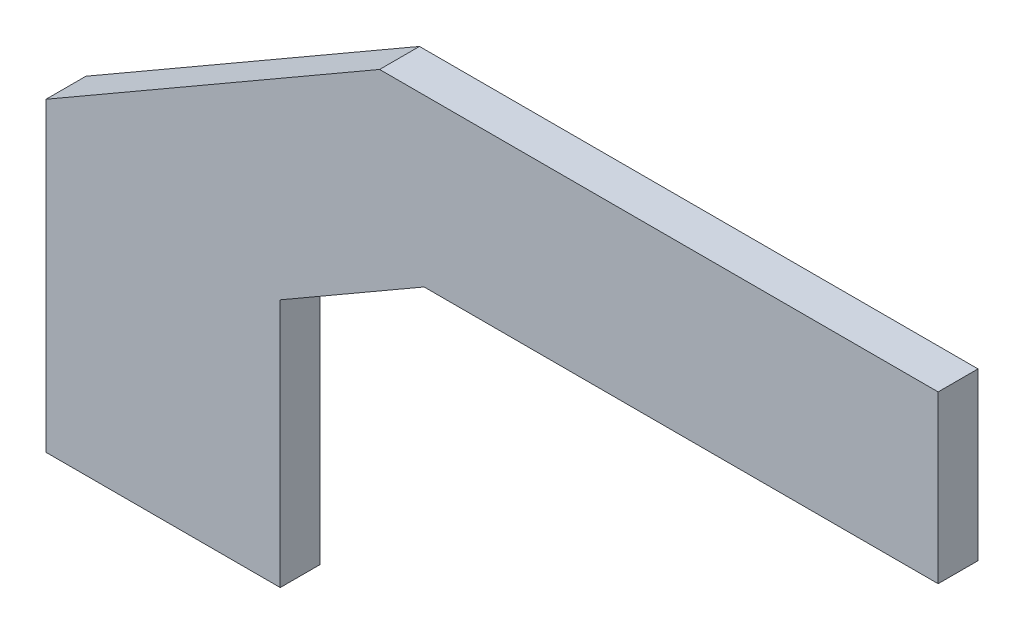
ISO-10303-21;
HEADER;
FILE_DESCRIPTION(('STEP AP214'),'2;1');
FILE_NAME('part.step','',(''),(''),'','','');
FILE_SCHEMA(('AUTOMOTIVE_DESIGN { 1 0 10303 214 1 1 1 1 }'));
ENDSEC;
DATA;
#1=APPLICATION_CONTEXT('core data for automotive mechanical design processes');
#2=APPLICATION_PROTOCOL_DEFINITION('international standard','automotive_design',2000,#1);
#3=PRODUCT_CONTEXT('',#1,'mechanical');
#4=PRODUCT('Part','Part','',(#3));
#5=PRODUCT_RELATED_PRODUCT_CATEGORY('part','',(#4));
#6=PRODUCT_DEFINITION_FORMATION('','',#4);
#7=PRODUCT_DEFINITION_CONTEXT('part definition',#1,'design');
#8=PRODUCT_DEFINITION('design','',#6,#7);
#9=PRODUCT_DEFINITION_SHAPE('','',#8);
#10=(LENGTH_UNIT() NAMED_UNIT(*) SI_UNIT(.MILLI.,.METRE.));
#11=(NAMED_UNIT(*) PLANE_ANGLE_UNIT() SI_UNIT($,.RADIAN.));
#12=(NAMED_UNIT(*) SI_UNIT($,.STERADIAN.) SOLID_ANGLE_UNIT());
#13=UNCERTAINTY_MEASURE_WITH_UNIT(LENGTH_MEASURE(1.E-05),#10,'distance_accuracy_value','');
#14=(GEOMETRIC_REPRESENTATION_CONTEXT(3) GLOBAL_UNCERTAINTY_ASSIGNED_CONTEXT((#13)) GLOBAL_UNIT_ASSIGNED_CONTEXT((#10,
#11,#12)) REPRESENTATION_CONTEXT('',''));
#15=CARTESIAN_POINT('',(0.,0.,0.));
#16=DIRECTION('',(0.,0.,1.));
#17=DIRECTION('',(1.,0.,0.));
#18=AXIS2_PLACEMENT_3D('',#15,#16,#17);
#19=CARTESIAN_POINT('',(1.41,1.5,0.12));
#20=DIRECTION('',(-0.500000000000001,0.866025403784438,0.));
#21=DIRECTION('',(-0.866025403784438,-0.500000000000001,0.));
#22=AXIS2_PLACEMENT_3D('',#19,#20,#21);
#23=PLANE('',#22);
#24=DIRECTION('',(0.866025403784438,0.500000000000001,0.));
#25=VECTOR('',#24,1.);
#26=CARTESIAN_POINT('',(1.41,1.5,-0.12));
#27=LINE('',#26,#25);
#28=CARTESIAN_POINT('',(1.41,1.5,-0.12));
#29=VERTEX_POINT('',#28);
#30=CARTESIAN_POINT('',(2.27602540378444,2.,-0.12));
#31=VERTEX_POINT('',#30);
#32=EDGE_CURVE('E140',#29,#31,#27,.T.);
#33=ORIENTED_EDGE('',*,*,#32,.T.);
#34=DIRECTION('',(0.,0.,-1.));
#35=VECTOR('',#34,1.);
#36=CARTESIAN_POINT('',(2.27602540378444,2.,0.12));
#37=LINE('',#36,#35);
#38=CARTESIAN_POINT('',(2.27602540378444,2.,0.12));
#39=VERTEX_POINT('',#38);
#40=EDGE_CURVE('E11',#39,#31,#37,.T.);
#41=ORIENTED_EDGE('',*,*,#40,.F.);
#42=DIRECTION('',(0.866025403784438,0.500000000000001,0.));
#43=VECTOR('',#42,1.);
#44=CARTESIAN_POINT('',(1.41,1.5,0.12));
#45=LINE('',#44,#43);
#46=CARTESIAN_POINT('',(1.41,1.5,0.12));
#47=VERTEX_POINT('',#46);
#48=EDGE_CURVE('E162',#47,#39,#45,.T.);
#49=ORIENTED_EDGE('',*,*,#48,.F.);
#50=DIRECTION('',(0.,0.,-1.));
#51=VECTOR('',#50,1.);
#52=CARTESIAN_POINT('',(1.41,1.5,0.12));
#53=LINE('',#52,#51);
#54=EDGE_CURVE('E136',#47,#29,#53,.T.);
#55=ORIENTED_EDGE('',*,*,#54,.T.);
#56=EDGE_LOOP('',(#33,#41,#49,#55));
#57=FACE_BOUND('',#56,.T.);
#58=ADVANCED_FACE('F39',(#57),#23,.F.);
#59=CARTESIAN_POINT('',(2.27602540378444,2.,0.12));
#60=DIRECTION('',(0.,1.,0.));
#61=DIRECTION('',(-1.,0.,0.));
#62=AXIS2_PLACEMENT_3D('',#59,#60,#61);
#63=PLANE('',#62);
#64=DIRECTION('',(1.,0.,0.));
#65=VECTOR('',#64,1.);
#66=CARTESIAN_POINT('',(2.27602540378444,2.,-0.12));
#67=LINE('',#66,#65);
#68=CARTESIAN_POINT('',(5.37,2.,-0.12));
#69=VERTEX_POINT('',#68);
#70=EDGE_CURVE('E144',#31,#69,#67,.T.);
#71=ORIENTED_EDGE('',*,*,#70,.T.);
#72=DIRECTION('',(0.,0.,-1.));
#73=VECTOR('',#72,1.);
#74=CARTESIAN_POINT('',(5.37,2.,0.12));
#75=LINE('',#74,#73);
#76=CARTESIAN_POINT('',(5.37,2.,0.12));
#77=VERTEX_POINT('',#76);
#78=EDGE_CURVE('E48',#77,#69,#75,.T.);
#79=ORIENTED_EDGE('',*,*,#78,.F.);
#80=DIRECTION('',(1.,0.,0.));
#81=VECTOR('',#80,1.);
#82=CARTESIAN_POINT('',(2.27602540378444,2.,0.12));
#83=LINE('',#82,#81);
#84=EDGE_CURVE('E99',#39,#77,#83,.T.);
#85=ORIENTED_EDGE('',*,*,#84,.F.);
#86=ORIENTED_EDGE('',*,*,#40,.T.);
#87=EDGE_LOOP('',(#71,#79,#85,#86));
#88=FACE_BOUND('',#87,.T.);
#89=ADVANCED_FACE('F208',(#88),#63,.F.);
#90=CARTESIAN_POINT('',(5.37,2.,0.12));
#91=DIRECTION('',(-1.,0.,0.));
#92=DIRECTION('',(0.,-1.,0.));
#93=AXIS2_PLACEMENT_3D('',#90,#91,#92);
#94=PLANE('',#93);
#95=DIRECTION('',(0.,1.,0.));
#96=VECTOR('',#95,1.);
#97=CARTESIAN_POINT('',(5.37,2.,-0.12));
#98=LINE('',#97,#96);
#99=CARTESIAN_POINT('',(5.37,3.,-0.12));
#100=VERTEX_POINT('',#99);
#101=EDGE_CURVE('E147',#69,#100,#98,.T.);
#102=ORIENTED_EDGE('',*,*,#101,.T.);
#103=DIRECTION('',(0.,0.,-1.));
#104=VECTOR('',#103,1.);
#105=CARTESIAN_POINT('',(5.37,3.,0.12));
#106=LINE('',#105,#104);
#107=CARTESIAN_POINT('',(5.37,3.,0.12));
#108=VERTEX_POINT('',#107);
#109=EDGE_CURVE('E173',#108,#100,#106,.T.);
#110=ORIENTED_EDGE('',*,*,#109,.F.);
#111=DIRECTION('',(0.,1.,0.));
#112=VECTOR('',#111,1.);
#113=CARTESIAN_POINT('',(5.37,2.,0.12));
#114=LINE('',#113,#112);
#115=EDGE_CURVE('E183',#77,#108,#114,.T.);
#116=ORIENTED_EDGE('',*,*,#115,.F.);
#117=ORIENTED_EDGE('',*,*,#78,.T.);
#118=EDGE_LOOP('',(#102,#110,#116,#117));
#119=FACE_BOUND('',#118,.T.);
#120=ADVANCED_FACE('F181',(#119),#94,.F.);
#121=CARTESIAN_POINT('',(5.37,3.,0.12));
#122=DIRECTION('',(0.,-1.,0.));
#123=DIRECTION('',(1.,0.,0.));
#124=AXIS2_PLACEMENT_3D('',#121,#122,#123);
#125=PLANE('',#124);
#126=DIRECTION('',(-1.,0.,0.));
#127=VECTOR('',#126,1.);
#128=CARTESIAN_POINT('',(5.37,3.,-0.12));
#129=LINE('',#128,#127);
#130=CARTESIAN_POINT('',(2.00807621135331,3.,-0.12));
#131=VERTEX_POINT('',#130);
#132=EDGE_CURVE('E150',#100,#131,#129,.T.);
#133=ORIENTED_EDGE('',*,*,#132,.T.);
#134=DIRECTION('',(0.,0.,-1.));
#135=VECTOR('',#134,1.);
#136=CARTESIAN_POINT('',(2.00807621135331,3.,0.12));
#137=LINE('',#136,#135);
#138=CARTESIAN_POINT('',(2.00807621135331,3.,0.12));
#139=VERTEX_POINT('',#138);
#140=EDGE_CURVE('E169',#139,#131,#137,.T.);
#141=ORIENTED_EDGE('',*,*,#140,.F.);
#142=DIRECTION('',(-1.,0.,0.));
#143=VECTOR('',#142,1.);
#144=CARTESIAN_POINT('',(5.37,3.,0.12));
#145=LINE('',#144,#143);
#146=EDGE_CURVE('E196',#108,#139,#145,.T.);
#147=ORIENTED_EDGE('',*,*,#146,.F.);
#148=ORIENTED_EDGE('',*,*,#109,.T.);
#149=EDGE_LOOP('',(#133,#141,#147,#148));
#150=FACE_BOUND('',#149,.T.);
#151=ADVANCED_FACE('F191',(#150),#125,.F.);
#152=CARTESIAN_POINT('',(2.00807621135331,3.,0.12));
#153=DIRECTION('',(0.500000000000001,-0.866025403784438,0.));
#154=DIRECTION('',(0.866025403784438,0.500000000000001,0.));
#155=AXIS2_PLACEMENT_3D('',#152,#153,#154);
#156=PLANE('',#155);
#157=DIRECTION('',(-0.866025403784438,-0.500000000000001,0.));
#158=VECTOR('',#157,1.);
#159=CARTESIAN_POINT('',(2.00807621135331,3.,-0.12));
#160=LINE('',#159,#158);
#161=CARTESIAN_POINT('',(0.,1.84063665882188,-0.12));
#162=VERTEX_POINT('',#161);
#163=EDGE_CURVE('E153',#131,#162,#160,.T.);
#164=ORIENTED_EDGE('',*,*,#163,.T.);
#165=DIRECTION('',(0.,0.,-1.));
#166=VECTOR('',#165,1.);
#167=CARTESIAN_POINT('',(0.,1.84063665882188,0.12));
#168=LINE('',#167,#166);
#169=CARTESIAN_POINT('',(0.,1.84063665882188,0.12));
#170=VERTEX_POINT('',#169);
#171=EDGE_CURVE('E129',#170,#162,#168,.T.);
#172=ORIENTED_EDGE('',*,*,#171,.F.);
#173=DIRECTION('',(-0.866025403784438,-0.500000000000001,0.));
#174=VECTOR('',#173,1.);
#175=CARTESIAN_POINT('',(2.00807621135331,3.,0.12));
#176=LINE('',#175,#174);
#177=EDGE_CURVE('E118',#139,#170,#176,.T.);
#178=ORIENTED_EDGE('',*,*,#177,.F.);
#179=ORIENTED_EDGE('',*,*,#140,.T.);
#180=EDGE_LOOP('',(#164,#172,#178,#179));
#181=FACE_BOUND('',#180,.T.);
#182=ADVANCED_FACE('F194',(#181),#156,.F.);
#183=CARTESIAN_POINT('',(0.,1.84063665882188,0.12));
#184=DIRECTION('',(1.,0.,0.));
#185=DIRECTION('',(0.,1.,0.));
#186=AXIS2_PLACEMENT_3D('',#183,#184,#185);
#187=PLANE('',#186);
#188=DIRECTION('',(0.,-1.,0.));
#189=VECTOR('',#188,1.);
#190=CARTESIAN_POINT('',(0.,1.84063665882188,-0.12));
#191=LINE('',#190,#189);
#192=CARTESIAN_POINT('',(0.,0.,-0.12));
#193=VERTEX_POINT('',#192);
#194=EDGE_CURVE('E127',#162,#193,#191,.T.);
#195=ORIENTED_EDGE('',*,*,#194,.T.);
#196=DIRECTION('',(0.,0.,-1.));
#197=VECTOR('',#196,1.);
#198=CARTESIAN_POINT('',(0.,0.,0.12));
#199=LINE('',#198,#197);
#200=CARTESIAN_POINT('',(0.,0.,0.12));
#201=VERTEX_POINT('',#200);
#202=EDGE_CURVE('E124',#201,#193,#199,.T.);
#203=ORIENTED_EDGE('',*,*,#202,.F.);
#204=DIRECTION('',(0.,-1.,0.));
#205=VECTOR('',#204,1.);
#206=CARTESIAN_POINT('',(0.,1.84063665882188,0.12));
#207=LINE('',#206,#205);
#208=EDGE_CURVE('E112',#170,#201,#207,.T.);
#209=ORIENTED_EDGE('',*,*,#208,.F.);
#210=ORIENTED_EDGE('',*,*,#171,.T.);
#211=EDGE_LOOP('',(#195,#203,#209,#210));
#212=FACE_BOUND('',#211,.T.);
#213=ADVANCED_FACE('F125',(#212),#187,.F.);
#214=CARTESIAN_POINT('',(0.,0.,0.12));
#215=DIRECTION('',(0.,1.,0.));
#216=DIRECTION('',(0.,0.,1.));
#217=AXIS2_PLACEMENT_3D('',#214,#215,#216);
#218=PLANE('',#217);
#219=DIRECTION('',(1.,0.,0.));
#220=VECTOR('',#219,1.);
#221=CARTESIAN_POINT('',(0.,0.,-0.12));
#222=LINE('',#221,#220);
#223=CARTESIAN_POINT('',(1.41,0.,-0.12));
#224=VERTEX_POINT('',#223);
#225=EDGE_CURVE('E85',#193,#224,#222,.T.);
#226=ORIENTED_EDGE('',*,*,#225,.T.);
#227=DIRECTION('',(0.,0.,-1.));
#228=VECTOR('',#227,1.);
#229=CARTESIAN_POINT('',(1.41,0.,0.12));
#230=LINE('',#229,#228);
#231=CARTESIAN_POINT('',(1.41,0.,0.12));
#232=VERTEX_POINT('',#231);
#233=EDGE_CURVE('E130',#232,#224,#230,.T.);
#234=ORIENTED_EDGE('',*,*,#233,.F.);
#235=DIRECTION('',(1.,0.,0.));
#236=VECTOR('',#235,1.);
#237=CARTESIAN_POINT('',(0.,0.,0.12));
#238=LINE('',#237,#236);
#239=EDGE_CURVE('E116',#201,#232,#238,.T.);
#240=ORIENTED_EDGE('',*,*,#239,.F.);
#241=ORIENTED_EDGE('',*,*,#202,.T.);
#242=EDGE_LOOP('',(#226,#234,#240,#241));
#243=FACE_BOUND('',#242,.T.);
#244=ADVANCED_FACE('F132',(#243),#218,.F.);
#245=CARTESIAN_POINT('',(1.41,0.,0.12));
#246=DIRECTION('',(-1.,0.,0.));
#247=DIRECTION('',(0.,-1.,0.));
#248=AXIS2_PLACEMENT_3D('',#245,#246,#247);
#249=PLANE('',#248);
#250=DIRECTION('',(0.,1.,0.));
#251=VECTOR('',#250,1.);
#252=CARTESIAN_POINT('',(1.41,0.,-0.12));
#253=LINE('',#252,#251);
#254=EDGE_CURVE('E91',#224,#29,#253,.T.);
#255=ORIENTED_EDGE('',*,*,#254,.T.);
#256=ORIENTED_EDGE('',*,*,#54,.F.);
#257=DIRECTION('',(0.,1.,0.));
#258=VECTOR('',#257,1.);
#259=CARTESIAN_POINT('',(1.41,0.,0.12));
#260=LINE('',#259,#258);
#261=EDGE_CURVE('E56',#232,#47,#260,.T.);
#262=ORIENTED_EDGE('',*,*,#261,.F.);
#263=ORIENTED_EDGE('',*,*,#233,.T.);
#264=EDGE_LOOP('',(#255,#256,#262,#263));
#265=FACE_BOUND('',#264,.T.);
#266=ADVANCED_FACE('F224',(#265),#249,.F.);
#267=CARTESIAN_POINT('',(0.,0.,0.12));
#268=DIRECTION('',(0.,0.,1.));
#269=DIRECTION('',(1.,0.,0.));
#270=AXIS2_PLACEMENT_3D('',#267,#268,#269);
#271=PLANE('',#270);
#272=ORIENTED_EDGE('',*,*,#48,.T.);
#273=ORIENTED_EDGE('',*,*,#84,.T.);
#274=ORIENTED_EDGE('',*,*,#115,.T.);
#275=ORIENTED_EDGE('',*,*,#146,.T.);
#276=ORIENTED_EDGE('',*,*,#177,.T.);
#277=ORIENTED_EDGE('',*,*,#208,.T.);
#278=ORIENTED_EDGE('',*,*,#239,.T.);
#279=ORIENTED_EDGE('',*,*,#261,.T.);
#280=EDGE_LOOP('',(#272,#273,#274,#275,#276,#277,#278,#279));
#281=FACE_BOUND('',#280,.T.);
#282=ADVANCED_FACE('F114',(#281),#271,.T.);
#283=CARTESIAN_POINT('',(0.,0.,-0.12));
#284=DIRECTION('',(0.,0.,1.));
#285=DIRECTION('',(1.,0.,0.));
#286=AXIS2_PLACEMENT_3D('',#283,#284,#285);
#287=PLANE('',#286);
#288=ORIENTED_EDGE('',*,*,#32,.F.);
#289=ORIENTED_EDGE('',*,*,#254,.F.);
#290=ORIENTED_EDGE('',*,*,#225,.F.);
#291=ORIENTED_EDGE('',*,*,#194,.F.);
#292=ORIENTED_EDGE('',*,*,#163,.F.);
#293=ORIENTED_EDGE('',*,*,#132,.F.);
#294=ORIENTED_EDGE('',*,*,#101,.F.);
#295=ORIENTED_EDGE('',*,*,#70,.F.);
#296=EDGE_LOOP('',(#288,#289,#290,#291,#292,#293,#294,#295));
#297=FACE_BOUND('',#296,.T.);
#298=ADVANCED_FACE('F187',(#297),#287,.F.);
#299=CLOSED_SHELL('',(#58,#89,#120,#151,#182,#213,#244,#266,#282,#298));
#300=MANIFOLD_SOLID_BREP('B2',#299);
#301=ADVANCED_BREP_SHAPE_REPRESENTATION('',(#18,#300),#14);
#302=SHAPE_DEFINITION_REPRESENTATION(#9,#301);
ENDSEC;
END-ISO-10303-21;
